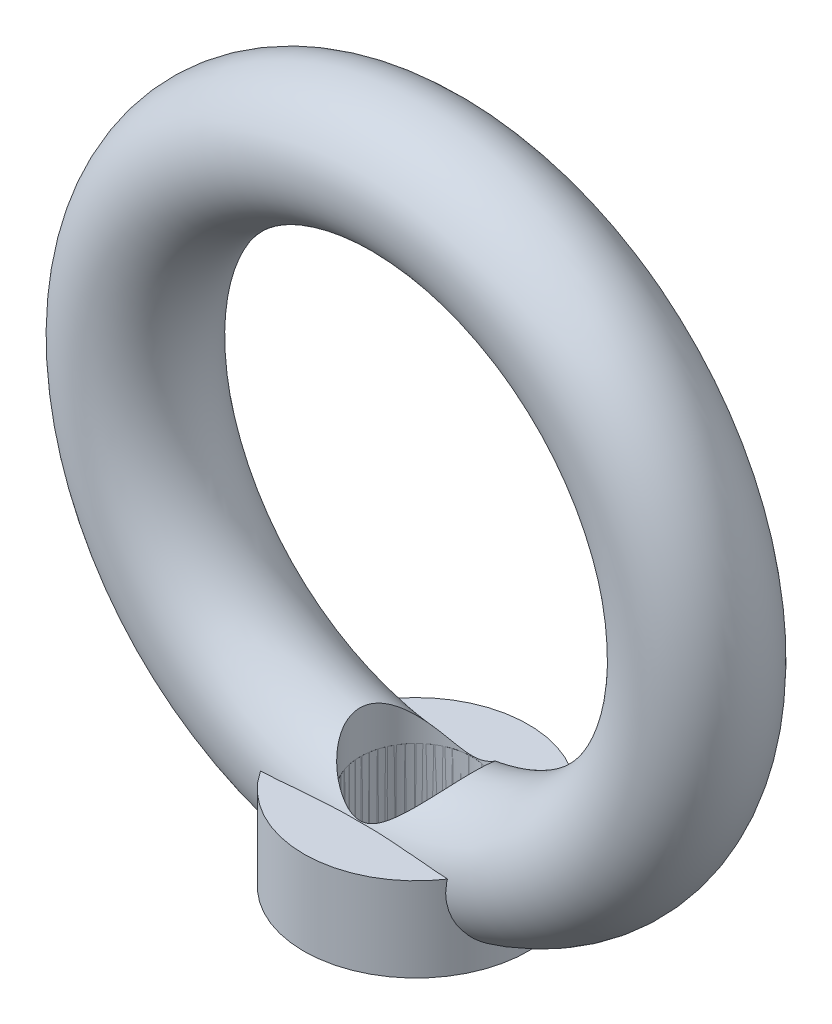
ISO-10303-21;
HEADER;
FILE_DESCRIPTION(('STEP AP214'),'2;1');
FILE_NAME('part.step','',(''),(''),'','','');
FILE_SCHEMA(('AUTOMOTIVE_DESIGN { 1 0 10303 214 1 1 1 1 }'));
ENDSEC;
DATA;
#1=APPLICATION_CONTEXT('core data for automotive mechanical design processes');
#2=APPLICATION_PROTOCOL_DEFINITION('international standard','automotive_design',2000,#1);
#3=PRODUCT_CONTEXT('',#1,'mechanical');
#4=PRODUCT('Part','Part','',(#3));
#5=PRODUCT_RELATED_PRODUCT_CATEGORY('part','',(#4));
#6=PRODUCT_DEFINITION_FORMATION('','',#4);
#7=PRODUCT_DEFINITION_CONTEXT('part definition',#1,'design');
#8=PRODUCT_DEFINITION('design','',#6,#7);
#9=PRODUCT_DEFINITION_SHAPE('','',#8);
#10=(LENGTH_UNIT() NAMED_UNIT(*) SI_UNIT(.MILLI.,.METRE.));
#11=(NAMED_UNIT(*) PLANE_ANGLE_UNIT() SI_UNIT($,.RADIAN.));
#12=(NAMED_UNIT(*) SI_UNIT($,.STERADIAN.) SOLID_ANGLE_UNIT());
#13=UNCERTAINTY_MEASURE_WITH_UNIT(LENGTH_MEASURE(1.E-05),#10,'distance_accuracy_value','');
#14=(GEOMETRIC_REPRESENTATION_CONTEXT(3) GLOBAL_UNCERTAINTY_ASSIGNED_CONTEXT((#13)) GLOBAL_UNIT_ASSIGNED_CONTEXT((#10,
#11,#12)) REPRESENTATION_CONTEXT('',''));
#15=CARTESIAN_POINT('',(0.,0.,0.));
#16=DIRECTION('',(0.,0.,1.));
#17=DIRECTION('',(1.,0.,0.));
#18=AXIS2_PLACEMENT_3D('',#15,#16,#17);
#19=CARTESIAN_POINT('',(0.,-9.,0.));
#20=DIRECTION('',(0.,1.,0.));
#21=DIRECTION('',(0.,0.,1.));
#22=AXIS2_PLACEMENT_3D('',#19,#20,#21);
#23=PLANE('',#22);
#24=CARTESIAN_POINT('',(0.,-9.,0.));
#25=DIRECTION('',(0.,1.,0.));
#26=DIRECTION('',(0.,0.,1.));
#27=AXIS2_PLACEMENT_3D('',#24,#25,#26);
#28=CIRCLE('',#27,4.);
#29=CARTESIAN_POINT('',(0.,-9.,4.));
#30=VERTEX_POINT('',#29);
#31=EDGE_CURVE('E11',#30,#30,#28,.T.);
#32=ORIENTED_EDGE('',*,*,#31,.T.);
#33=EDGE_LOOP('',(#32));
#34=FACE_BOUND('',#33,.T.);
#35=CARTESIAN_POINT('',(0.,-9.,0.));
#36=DIRECTION('',(0.,1.,0.));
#37=DIRECTION('',(0.,0.,1.));
#38=AXIS2_PLACEMENT_3D('',#35,#36,#37);
#39=CIRCLE('',#38,2.);
#40=CARTESIAN_POINT('',(0.,-9.,2.));
#41=VERTEX_POINT('',#40);
#42=EDGE_CURVE('E58',#41,#41,#39,.T.);
#43=ORIENTED_EDGE('',*,*,#42,.F.);
#44=EDGE_LOOP('',(#43));
#45=FACE_BOUND('',#44,.T.);
#46=ADVANCED_FACE('F47',(#34,#45),#23,.T.);
#47=CARTESIAN_POINT('',(0.,-12.,0.));
#48=DIRECTION('',(0.,1.,0.));
#49=DIRECTION('',(0.,0.,1.));
#50=AXIS2_PLACEMENT_3D('',#47,#48,#49);
#51=PLANE('',#50);
#52=CARTESIAN_POINT('',(0.,-12.,0.));
#53=DIRECTION('',(0.,1.,0.));
#54=DIRECTION('',(0.,0.,1.));
#55=AXIS2_PLACEMENT_3D('',#52,#53,#54);
#56=CIRCLE('',#55,4.);
#57=CARTESIAN_POINT('',(0.,-12.,4.));
#58=VERTEX_POINT('',#57);
#59=EDGE_CURVE('E51',#58,#58,#56,.T.);
#60=ORIENTED_EDGE('',*,*,#59,.F.);
#61=EDGE_LOOP('',(#60));
#62=FACE_BOUND('',#61,.T.);
#63=CARTESIAN_POINT('',(0.,-12.,0.));
#64=DIRECTION('',(0.,1.,0.));
#65=DIRECTION('',(0.,0.,1.));
#66=AXIS2_PLACEMENT_3D('',#63,#64,#65);
#67=CIRCLE('',#66,2.);
#68=CARTESIAN_POINT('',(0.,-12.,2.));
#69=VERTEX_POINT('',#68);
#70=EDGE_CURVE('E60',#69,#69,#67,.T.);
#71=ORIENTED_EDGE('',*,*,#70,.T.);
#72=EDGE_LOOP('',(#71));
#73=FACE_BOUND('',#72,.T.);
#74=ADVANCED_FACE('F70',(#62,#73),#51,.F.);
#75=CARTESIAN_POINT('',(0.,-9.,0.));
#76=DIRECTION('',(0.,-1.,0.));
#77=DIRECTION('',(0.,0.,-1.));
#78=AXIS2_PLACEMENT_3D('',#75,#76,#77);
#79=CYLINDRICAL_SURFACE('',#78,4.);
#80=ORIENTED_EDGE('',*,*,#31,.F.);
#81=EDGE_LOOP('',(#80));
#82=FACE_BOUND('',#81,.T.);
#83=ORIENTED_EDGE('',*,*,#59,.T.);
#84=EDGE_LOOP('',(#83));
#85=FACE_BOUND('',#84,.T.);
#86=ADVANCED_FACE('F49',(#82,#85),#79,.T.);
#87=CARTESIAN_POINT('',(0.,-9.,0.));
#88=DIRECTION('',(0.,-1.,0.));
#89=DIRECTION('',(0.,0.,-1.));
#90=AXIS2_PLACEMENT_3D('',#87,#88,#89);
#91=CYLINDRICAL_SURFACE('',#90,2.);
#92=ORIENTED_EDGE('',*,*,#42,.T.);
#93=EDGE_LOOP('',(#92));
#94=FACE_BOUND('',#93,.T.);
#95=ORIENTED_EDGE('',*,*,#70,.F.);
#96=EDGE_LOOP('',(#95));
#97=FACE_BOUND('',#96,.T.);
#98=ADVANCED_FACE('F66',(#94,#97),#91,.F.);
#99=CLOSED_SHELL('',(#46,#74,#86,#98));
#100=MANIFOLD_SOLID_BREP('B2',#99);
#101=CARTESIAN_POINT('',(0.,0.,0.));
#102=DIRECTION('',(0.,0.,-1.));
#103=DIRECTION('',(-1.,0.,0.));
#104=AXIS2_PLACEMENT_3D('',#101,#102,#103);
#105=TOROIDAL_SURFACE('',#104,10.,2.25);
#106=CARTESIAN_POINT('',(0.00947913291485531,-8.96917499990265,-1.99997753638364));
#107=CARTESIAN_POINT('',(-0.0465247045788909,-8.96973497754567,-2.00023859033637));
#108=CARTESIAN_POINT('',(-0.102633717571932,-8.9651251356805,-1.9981236990315));
#109=CARTESIAN_POINT('',(-0.212944447069803,-8.94652814074496,-1.98940818931956));
#110=CARTESIAN_POINT('',(-0.267140406044001,-8.93251486332256,-1.98279507337462));
#111=CARTESIAN_POINT('',(-0.394250947502609,-8.89028512718679,-1.96220851490686));
#112=CARTESIAN_POINT('',(-0.465656074420597,-8.85859337961999,-1.94632353473735));
#113=CARTESIAN_POINT('',(-0.602611359044454,-8.78720529324907,-1.90838850456801));
#114=CARTESIAN_POINT('',(-0.668138441115085,-8.74747924271782,-1.88631544982045));
#115=CARTESIAN_POINT('',(-0.790974048458028,-8.66582806455574,-1.83806418493892));
#116=CARTESIAN_POINT('',(-0.84853025820624,-8.62411436826384,-1.81214862462502));
#117=CARTESIAN_POINT('',(-0.95979127780467,-8.53861650651121,-1.75576017822046));
#118=CARTESIAN_POINT('',(-1.01349278078974,-8.49483061554779,-1.7252834467374));
#119=CARTESIAN_POINT('',(-1.11742946843156,-8.40643167159835,-1.65985619100568));
#120=CARTESIAN_POINT('',(-1.1676627849387,-8.36181818899002,-1.62490328414546));
#121=CARTESIAN_POINT('',(-1.26480043976249,-8.27271923802969,-1.55049002379123));
#122=CARTESIAN_POINT('',(-1.31170399321756,-8.22823380221492,-1.51102861327548));
#123=CARTESIAN_POINT('',(-1.43721428396703,-8.10612212128952,-1.39512833748848));
#124=CARTESIAN_POINT('',(-1.51227944202285,-8.02947849800628,-1.31369813968429));
#125=CARTESIAN_POINT('',(-1.65039276410907,-7.88404064174601,-1.13528221548769));
#126=CARTESIAN_POINT('',(-1.71347383103495,-7.81522513129827,-1.03834046738713));
#127=CARTESIAN_POINT('',(-1.80582565559466,-7.71231301606128,-0.863270568235746));
#128=CARTESIAN_POINT('',(-1.83934607226149,-7.67430505908354,-0.789705604078638));
#129=CARTESIAN_POINT('',(-1.89810488942724,-7.60696696405426,-0.635587479200465));
#130=CARTESIAN_POINT('',(-1.92335459514726,-7.57762498593498,-0.555044049497358));
#131=CARTESIAN_POINT('',(-1.96075769525226,-7.53388228594555,-0.400906789631065));
#132=CARTESIAN_POINT('',(-1.97431717055109,-7.51788973129134,-0.328113656309125));
#133=CARTESIAN_POINT('',(-1.99327557171502,-7.49548004681991,-0.180027908666608));
#134=CARTESIAN_POINT('',(-1.99868048876417,-7.48905588711204,-0.104737170951046));
#135=CARTESIAN_POINT('',(-2.0008925474968,-7.48643010724305,0.0462944965995305));
#136=CARTESIAN_POINT('',(-1.99768360892494,-7.49024760609524,0.122036004686834));
#137=CARTESIAN_POINT('',(-1.98290671754629,-7.50774455797193,0.271538209424397));
#138=CARTESIAN_POINT('',(-1.97133403210257,-7.5214295945452,0.345297760061987));
#139=CARTESIAN_POINT('',(-1.94091908352595,-7.55711745359702,0.487934789613104));
#140=CARTESIAN_POINT('',(-1.92218693820093,-7.5789941830923,0.55686836447712));
#141=CARTESIAN_POINT('',(-1.87849139833235,-7.62950407214588,0.69006554959925));
#142=CARTESIAN_POINT('',(-1.85352639636568,-7.65813897449944,0.754327949655842));
#143=CARTESIAN_POINT('',(-1.78074904748334,-7.7405576372625,0.917169552607534));
#144=CARTESIAN_POINT('',(-1.72851137081128,-7.79874408222048,1.01154133775907));
#145=CARTESIAN_POINT('',(-1.61301334704299,-7.923794708594,1.1871430406399));
#146=CARTESIAN_POINT('',(-1.54970971399601,-7.9906926940339,1.26831884023191));
#147=CARTESIAN_POINT('',(-1.43522946397048,-8.10729444100669,1.39460312932851));
#148=CARTESIAN_POINT('',(-1.38646144556287,-8.15582376716532,1.44304660112749));
#149=CARTESIAN_POINT('',(-1.28477660128321,-8.25393852620772,1.534282286448));
#150=CARTESIAN_POINT('',(-1.231857079652,-8.30352462982987,1.57707077871291));
#151=CARTESIAN_POINT('',(-1.12200773780673,-8.40245493929884,1.65701648675027));
#152=CARTESIAN_POINT('',(-1.06508746587847,-8.45179943933945,1.69418648514512));
#153=CARTESIAN_POINT('',(-0.946845573109951,-8.54896153028921,1.76299812700916));
#154=CARTESIAN_POINT('',(-0.885528233430776,-8.5967805426374,1.79464504756664));
#155=CARTESIAN_POINT('',(-0.768382010083402,-8.68126370847646,1.84743088080432));
#156=CARTESIAN_POINT('',(-0.713335104754199,-8.71846078635971,1.86944205887742));
#157=CARTESIAN_POINT('',(-0.599038933498382,-8.78858441871566,1.90913894247631));
#158=CARTESIAN_POINT('',(-0.539791082009121,-8.82151240010888,1.92682609504201));
#159=CARTESIAN_POINT('',(-0.425687945040576,-8.8757558205012,1.95491843361753));
#160=CARTESIAN_POINT('',(-0.371493083890968,-8.89807043377914,1.96601589267927));
#161=CARTESIAN_POINT('',(-0.259801036828623,-8.93471344769276,1.98385345522235));
#162=CARTESIAN_POINT('',(-0.202313980794896,-8.94906503207832,1.99060621721563));
#163=CARTESIAN_POINT('',(-0.0955955753728138,-8.96551995370505,1.99829809057988));
#164=CARTESIAN_POINT('',(-0.0466958772799337,-8.96933678731547,2.00005235771704));
#165=CARTESIAN_POINT('',(0.0510715598284761,-8.96910522247194,1.99994524896229));
#166=CARTESIAN_POINT('',(0.0999393029323301,-8.96505819663468,1.99808450406156));
#167=CARTESIAN_POINT('',(0.206783348261906,-8.94810036427411,1.99015241566743));
#168=CARTESIAN_POINT('',(0.264411174715209,-8.93344277507018,1.98324833116273));
#169=CARTESIAN_POINT('',(0.376372789830752,-8.89620312137371,1.96509259512848));
#170=CARTESIAN_POINT('',(0.430694808995071,-8.87359448786557,1.95382635421962));
#171=CARTESIAN_POINT('',(0.529662301297103,-8.82611309683543,1.92918211777213));
#172=CARTESIAN_POINT('',(0.574695408229153,-8.80181698164424,1.91620683511745));
#173=CARTESIAN_POINT('',(0.662319934928244,-8.7504408784613,1.88771128191146));
#174=CARTESIAN_POINT('',(0.704909289083638,-8.72335858788459,1.87218889994923));
#175=CARTESIAN_POINT('',(0.829642384246176,-8.63925782568437,1.82202272838793));
#176=CARTESIAN_POINT('',(0.908528441021871,-8.57950384093659,1.783838221169));
#177=CARTESIAN_POINT('',(1.04391505453244,-8.46972700016,1.70733330623213));
#178=CARTESIAN_POINT('',(1.10172397122508,-8.4201685017534,1.67058961400363));
#179=CARTESIAN_POINT('',(1.21318542495921,-8.32073071646747,1.59149476528975));
#180=CARTESIAN_POINT('',(1.26683529746224,-8.27085124575319,1.54914006034667));
#181=CARTESIAN_POINT('',(1.36989491557846,-8.17209177967528,1.45879175518347));
#182=CARTESIAN_POINT('',(1.41931256707451,-8.12321005668553,1.41080908402356));
#183=CARTESIAN_POINT('',(1.5137747309215,-8.02750727672924,1.30893335004023));
#184=CARTESIAN_POINT('',(1.55882245584647,-7.98068472001346,1.25504469206756));
#185=CARTESIAN_POINT('',(1.65384087666381,-7.87999785961372,1.12803306702979));
#186=CARTESIAN_POINT('',(1.7025983459718,-7.82695647644894,1.05332394726021));
#187=CARTESIAN_POINT('',(1.79129934028979,-7.72873395215454,0.894156232463209));
#188=CARTESIAN_POINT('',(1.83125804989802,-7.68353929838517,0.809714823026247));
#189=CARTESIAN_POINT('',(1.89303542452584,-7.61280158983799,0.649747022158888));
#190=CARTESIAN_POINT('',(1.91689530380694,-7.58512815349597,0.575968309195471));
#191=CARTESIAN_POINT('',(1.95625390784741,-7.53918523924031,0.423389092414931));
#192=CARTESIAN_POINT('',(1.97176048968997,-7.52090692505116,0.344593385864329));
#193=CARTESIAN_POINT('',(1.99325705059917,-7.49550647946059,0.183266542412526));
#194=CARTESIAN_POINT('',(1.99917416484712,-7.48846977221551,0.100711660495798));
#195=CARTESIAN_POINT('',(2.00066299306253,-7.48670267804532,-0.0646185499526013));
#196=CARTESIAN_POINT('',(1.99623705904687,-7.49196949328993,-0.147393824091253));
#197=CARTESIAN_POINT('',(1.97858301235252,-7.5128530244733,-0.300812094211115));
#198=CARTESIAN_POINT('',(1.96641987567907,-7.52721668538021,-0.371759655452356));
#199=CARTESIAN_POINT('',(1.93518740601831,-7.56381371692808,-0.509977621257046));
#200=CARTESIAN_POINT('',(1.91611499867525,-7.58605059074156,-0.57724637353404));
#201=CARTESIAN_POINT('',(1.86202387391097,-7.64847003490578,-0.736770050698773));
#202=CARTESIAN_POINT('',(1.82369678018324,-7.69221637934302,-0.826500372806554));
#203=CARTESIAN_POINT('',(1.73715733513364,-7.78897287542402,-0.995673656879974));
#204=CARTESIAN_POINT('',(1.68891901692024,-7.84200730636543,-1.0750886826193));
#205=CARTESIAN_POINT('',(1.59869714415327,-7.93867075886756,-1.20355043232682));
#206=CARTESIAN_POINT('',(1.55857953782028,-7.98093592830986,-1.25498293285842));
#207=CARTESIAN_POINT('',(1.47454061417007,-8.06755393022587,-1.35273295352575));
#208=CARTESIAN_POINT('',(1.43061877359828,-8.11190704950307,-1.39904976802313));
#209=CARTESIAN_POINT('',(1.33916613542405,-8.20185069323612,-1.48682818659266));
#210=CARTESIAN_POINT('',(1.29163046912578,-8.24744283188536,-1.52828304229497));
#211=CARTESIAN_POINT('',(1.19308140645008,-8.33888894423774,-1.60639507514014));
#212=CARTESIAN_POINT('',(1.14206941707396,-8.38474280520733,-1.64305417597397));
#213=CARTESIAN_POINT('',(1.01295483860557,-8.49602386122561,-1.7269115867385));
#214=CARTESIAN_POINT('',(0.932864895965993,-8.56112009458628,-1.77158114652454));
#215=CARTESIAN_POINT('',(0.806154471556868,-8.65446622570964,-1.8309211466141));
#216=CARTESIAN_POINT('',(0.762858164284908,-8.68484315442146,-1.8494122845202));
#217=CARTESIAN_POINT('',(0.673746288188683,-8.74331332678028,-1.88370540033746));
#218=CARTESIAN_POINT('',(0.627932464871249,-8.77140812006053,-1.89950921112704));
#219=CARTESIAN_POINT('',(0.528298965504772,-8.82699910169208,-1.92974116727346));
#220=CARTESIAN_POINT('',(0.474150153605593,-8.85409902449786,-1.94383359173813));
#221=CARTESIAN_POINT('',(0.362093900366199,-8.90151628488236,-1.96777681832627));
#222=CARTESIAN_POINT('',(0.304197707518788,-8.92185289002567,-1.97763969337612));
#223=CARTESIAN_POINT('',(0.206455771526146,-8.94710962663558,-1.98968843516269));
#224=CARTESIAN_POINT('',(0.167553794851842,-8.95494190087063,-1.99335822304056));
#225=CARTESIAN_POINT('',(0.0889448968321623,-8.96577422986823,-1.99840935794262));
#226=CARTESIAN_POINT('',(0.0492385199079548,-8.96877744914877,-1.99979220363509));
#227=CARTESIAN_POINT('',(0.00947913291485531,-8.96917499990265,-1.99997753638364));
#228=B_SPLINE_CURVE_WITH_KNOTS('',3,(#106,#107,#108,#109,#110,#111,#112,#113,#114,#115,#116,
#117,#118,#119,#120,#121,#122,#123,#124,#125,#126,#127,#128,#129,#130,#131,#132,#133,#134,#135,
#136,#137,#138,#139,#140,#141,#142,#143,#144,#145,#146,#147,#148,#149,#150,#151,#152,#153,#154,
#155,#156,#157,#158,#159,#160,#161,#162,#163,#164,#165,#166,#167,#168,#169,#170,#171,#172,#173,
#174,#175,#176,#177,#178,#179,#180,#181,#182,#183,#184,#185,#186,#187,#188,#189,#190,#191,#192,
#193,#194,#195,#196,#197,#198,#199,#200,#201,#202,#203,#204,#205,#206,#207,#208,#209,#210,#211,
#212,#213,#214,#215,#216,#217,#218,#219,#220,#221,#222,#223,#224,#225,#226,#227),.UNSPECIFIED.,
.T.,.F.,(4,2,2,2,2,2,2,2,2,2,2,2,2,2,2,2,2,2,2,2,2,2,2,2,2,2,2,2,2,2,2,2,2,2,2,2,2,2,2,2,2,2,2,
2,2,2,2,2,2,2,2,2,2,2,2,2,2,2,2,2,4),(0.,0.16783712894226,0.336142479274024,0.573932709112715,
0.812618944210012,1.0392874273788,1.2661480960984,1.49313002573833,1.72016528107265,
2.12282058788453,2.52435388210282,2.7914914843739,3.05826239794173,3.2845426011235,
3.51065647430855,3.73719274791077,3.96385730781839,4.18716743540473,4.41053521317359,
4.776148476917,5.14322526497457,5.39537284249173,5.64768552809288,5.89941524613493,
6.15090311343278,6.360586518314,6.57019965606096,6.74858746831332,6.92645315574132,
7.07295612626797,7.2194335273702,7.39798357416392,7.57713601906693,7.73527431209251,
7.89354436185438,8.21085357400131,8.4642463503455,8.71780014656506,8.97086946899981,
9.2237513134311,9.53419139178327,9.84409144972886,10.0901423173116,10.3359613443818,
10.5836395963316,10.8312615315431,11.0505534239839,11.2699430128492,11.588954673311,
11.9088130362903,12.1416958519218,12.3746107505144,12.6078452006393,12.8409858061452,
13.1774428404543,13.345408873832,13.5132598832446,13.6993372121617,13.8848798037879,
14.0041123287557,14.123266687815),.UNSPECIFIED.);
#229=CARTESIAN_POINT('',(0.00947913291485531,-8.96917499990265,-1.99997753638364));
#230=VERTEX_POINT('',#229);
#231=EDGE_CURVE('E120',#230,#230,#228,.T.);
#232=ORIENTED_EDGE('',*,*,#231,.F.);
#233=EDGE_LOOP('',(#232));
#234=FACE_BOUND('',#233,.T.);
#235=CARTESIAN_POINT('',(-1.35762130589315,-11.6255903124261,-1.46862670198773));
#236=CARTESIAN_POINT('',(-1.31324756533999,-11.5951901280932,-1.50964707688722));
#237=CARTESIAN_POINT('',(-1.26726864571846,-11.5641105931367,-1.54842404952915));
#238=CARTESIAN_POINT('',(-1.1723304999426,-11.5012324574823,-1.62149014641052));
#239=CARTESIAN_POINT('',(-1.12337091690305,-11.4694337709654,-1.65577873168528));
#240=CARTESIAN_POINT('',(-1.02247926283035,-11.4058194556859,-1.71991779237881));
#241=CARTESIAN_POINT('',(-0.970542107999674,-11.3740038957361,-1.74976034420155));
#242=CARTESIAN_POINT('',(-0.863741557627706,-11.3114150757814,-1.80487092223385));
#243=CARTESIAN_POINT('',(-0.808880009084109,-11.2806411775013,-1.83014179254159));
#244=CARTESIAN_POINT('',(-0.688353425185837,-11.2174700237956,-1.87908474078116));
#245=CARTESIAN_POINT('',(-0.62222915856496,-11.1854134470148,-1.90208170842315));
#246=CARTESIAN_POINT('',(-0.485525855190664,-11.1274303838431,-1.94146859323453));
#247=CARTESIAN_POINT('',(-0.414958942455735,-11.1014880583815,-1.95787566114775));
#248=CARTESIAN_POINT('',(-0.285524797120264,-11.0647058044197,-1.98034671524773));
#249=CARTESIAN_POINT('',(-0.227530573820753,-11.0517930568197,-1.98789709016928));
#250=CARTESIAN_POINT('',(-0.109888883738736,-11.0346131051629,-1.99784602556416));
#251=CARTESIAN_POINT('',(-0.0502455050524188,-11.0303261792929,-2.00025633887349));
#252=CARTESIAN_POINT('',(0.0690564747666991,-11.0313044284293,-1.99969943169404));
#253=CARTESIAN_POINT('',(0.128714851277267,-11.0365894180484,-1.99672105621178));
#254=CARTESIAN_POINT('',(0.246236335138954,-11.0556020180863,-1.98566663091491));
#255=CARTESIAN_POINT('',(0.304094573806312,-11.06935073276,-1.97757783696818));
#256=CARTESIAN_POINT('',(0.448831023518611,-11.1124280886762,-1.95105517820348));
#257=CARTESIAN_POINT('',(0.53374778276585,-11.1461701871948,-1.92936230253296));
#258=CARTESIAN_POINT('',(0.697215537193385,-11.2210806683202,-1.87651862250361));
#259=CARTESIAN_POINT('',(0.775738969684908,-11.2622789675305,-1.84532935850995));
#260=CARTESIAN_POINT('',(0.908801742451828,-11.337261518019,-1.78271958357469));
#261=CARTESIAN_POINT('',(0.964567782417709,-11.3704462342298,-1.75315830608526));
#262=CARTESIAN_POINT('',(1.07289961085636,-11.4372235467947,-1.6890396298383));
#263=CARTESIAN_POINT('',(1.12546395490952,-11.4708163191624,-1.65447999949387));
#264=CARTESIAN_POINT('',(1.27813486711221,-11.5706083672193,-1.54343281433163));
#265=CARTESIAN_POINT('',(1.37352515238005,-11.6360049625661,-1.45943283179854));
#266=CARTESIAN_POINT('',(1.5311063920515,-11.7461245300435,-1.2908041544553));
#267=CARTESIAN_POINT('',(1.59610598566961,-11.7923494398566,-1.20976393148416));
#268=CARTESIAN_POINT('',(1.71416988462416,-11.8770266714583,-1.0356923002503));
#269=CARTESIAN_POINT('',(1.76724017438279,-11.9154828894826,-0.942666941431237));
#270=CARTESIAN_POINT('',(1.8591679988147,-11.9823672003196,-0.745279888977114));
#271=CARTESIAN_POINT('',(1.89789291826441,-12.0107016411164,-0.640823447570946));
#272=CARTESIAN_POINT('',(1.95765919216911,-12.0545037030348,-0.424407992941673));
#273=CARTESIAN_POINT('',(1.97872061003803,-12.069985922385,-0.312457648375679));
#274=CARTESIAN_POINT('',(1.99971031728481,-12.0854178279914,-0.102722369221332));
#275=CARTESIAN_POINT('',(2.00234549855693,-12.0873569849134,-0.00534574326542001));
#276=CARTESIAN_POINT('',(1.99346426558238,-12.0808252034323,0.188387640766387));
#277=CARTESIAN_POINT('',(1.98195231273454,-12.0723575468914,0.284744710703171));
#278=CARTESIAN_POINT('',(1.94665301520049,-12.0464389571891,0.467646628172795));
#279=CARTESIAN_POINT('',(1.92365886997395,-12.0295686576319,0.554431253114089));
#280=CARTESIAN_POINT('',(1.86704666255578,-11.9881547069557,0.722499272705088));
#281=CARTESIAN_POINT('',(1.83342648241193,-11.9636095261108,0.803781566720327));
#282=CARTESIAN_POINT('',(1.75389101687198,-11.9058207979151,0.965738855641196));
#283=CARTESIAN_POINT('',(1.70720387541955,-11.8720361135519,1.04583829853087));
#284=CARTESIAN_POINT('',(1.60482424367234,-11.7985968622533,1.19703257326794));
#285=CARTESIAN_POINT('',(1.54912842378286,-11.7589401254756,1.26812405839494));
#286=CARTESIAN_POINT('',(1.41977368932011,-11.6681500999407,1.41252252108564));
#287=CARTESIAN_POINT('',(1.34467711036478,-11.6162232040088,1.48403719091235));
#288=CARTESIAN_POINT('',(1.18555618211332,-11.5095221954197,1.61401373765852));
#289=CARTESIAN_POINT('',(1.1015183755418,-11.4547438562424,1.67245551670631));
#290=CARTESIAN_POINT('',(0.931205160221009,-11.3500012449733,1.77255284792351));
#291=CARTESIAN_POINT('',(0.845488440297905,-11.2999664369153,1.81509103974242));
#292=CARTESIAN_POINT('',(0.666092271362495,-11.2056688064533,1.88830251167499));
#293=CARTESIAN_POINT('',(0.572430730046284,-11.1613935446104,1.91900165345477));
#294=CARTESIAN_POINT('',(0.416665674614541,-11.1029216936955,1.95700918901912));
#295=CARTESIAN_POINT('',(0.357522999854355,-11.0838572341755,1.96874083901812));
#296=CARTESIAN_POINT('',(0.236555577116849,-11.0536167214422,1.98689700514897));
#297=CARTESIAN_POINT('',(0.174740658543275,-11.0424140009651,1.99333947510399));
#298=CARTESIAN_POINT('',(0.0490777819946342,-11.0301182758225,2.00039378910816));
#299=CARTESIAN_POINT('',(-0.014784308050536,-11.0291272706363,2.00094680834334));
#300=CARTESIAN_POINT('',(-0.141585123161035,-11.0377933312606,1.99599560483191));
#301=CARTESIAN_POINT('',(-0.204522086306186,-11.0474685729653,1.99048104261097));
#302=CARTESIAN_POINT('',(-0.344768711872093,-11.0791290056642,1.97166306113257));
#303=CARTESIAN_POINT('',(-0.42120475351271,-11.1037903706175,1.95661933483329));
#304=CARTESIAN_POINT('',(-0.569055961795823,-11.1612530666836,1.9188656695565));
#305=CARTESIAN_POINT('',(-0.640449012963385,-11.1940877011946,1.89612422499985));
#306=CARTESIAN_POINT('',(-0.767596341710354,-11.2583052645878,1.84787736472846));
#307=CARTESIAN_POINT('',(-0.824041320676215,-11.2891005032854,1.82337344676899));
#308=CARTESIAN_POINT('',(-0.933876854991516,-11.3520517909319,1.769636947025));
#309=CARTESIAN_POINT('',(-0.987265644616869,-11.3842086082422,1.74040166827234));
#310=CARTESIAN_POINT('',(-1.09106839904522,-11.4487641457265,1.67727701799637));
#311=CARTESIAN_POINT('',(-1.1414820296088,-11.4811628926208,1.64338712497559));
#312=CARTESIAN_POINT('',(-1.23928874410379,-11.5453841037839,1.5709449244778));
#313=CARTESIAN_POINT('',(-1.28668030787932,-11.5772062723509,1.53239029836695));
#314=CARTESIAN_POINT('',(-1.3792157876268,-11.6402570650888,1.44972301503623));
#315=CARTESIAN_POINT('',(-1.42428646968931,-11.6714568387096,1.40550598875743));
#316=CARTESIAN_POINT('',(-1.51063407217496,-11.7318405603422,1.31225805796463));
#317=CARTESIAN_POINT('',(-1.55191175357587,-11.7610249124085,1.26322812314978));
#318=CARTESIAN_POINT('',(-1.63010237198582,-11.8166899293986,1.16056768884604));
#319=CARTESIAN_POINT('',(-1.66702488949634,-11.8431765106643,1.10694775284651));
#320=CARTESIAN_POINT('',(-1.7360019308511,-11.8928868448865,0.995291162687414));
#321=CARTESIAN_POINT('',(-1.76805895985366,-11.9161122764899,0.937256804705509));
#322=CARTESIAN_POINT('',(-1.83792499827557,-11.966881928194,0.794079430557492));
#323=CARTESIAN_POINT('',(-1.87324208799957,-11.9926786917697,0.707059899843502));
#324=CARTESIAN_POINT('',(-1.93164447505905,-12.035420760334,0.526973426500911));
#325=CARTESIAN_POINT('',(-1.95473750014405,-12.0523716573632,0.433910346335546));
#326=CARTESIAN_POINT('',(-1.98743834955804,-12.0763909532173,0.243769262410793));
#327=CARTESIAN_POINT('',(-1.99699169085579,-12.0834194242414,0.146676646655514));
#328=CARTESIAN_POINT('',(-2.00179217526217,-12.0869500612267,-0.0480480842069541));
#329=CARTESIAN_POINT('',(-1.99704162395855,-12.0834539236079,-0.145680109836748));
#330=CARTESIAN_POINT('',(-1.97433747163406,-12.0667662822767,-0.33200833625876));
#331=CARTESIAN_POINT('',(-1.95726186466526,-12.0542195463919,-0.420872945132144));
#332=CARTESIAN_POINT('',(-1.91183634908218,-12.0209153709098,-0.594055138699115));
#333=CARTESIAN_POINT('',(-1.88348284085986,-12.0001553098476,-0.678371261869342));
#334=CARTESIAN_POINT('',(-1.81518323067178,-11.9503339991071,-0.84474681843652));
#335=CARTESIAN_POINT('',(-1.77473411114868,-11.9209136624754,-0.926489567886015));
#336=CARTESIAN_POINT('',(-1.68455212168599,-11.8557484974665,-1.08182782750689));
#337=CARTESIAN_POINT('',(-1.63482304139914,-11.820006251074,-1.15542664393751));
#338=CARTESIAN_POINT('',(-1.54693267526989,-11.7575158096919,-1.26891262510673));
#339=CARTESIAN_POINT('',(-1.51105844766069,-11.7321664930183,-1.3113923449017));
#340=CARTESIAN_POINT('',(-1.43643280874445,-11.679926192893,-1.39273326228523));
#341=CARTESIAN_POINT('',(-1.39768118212485,-11.6530350941059,-1.43159418859204));
#342=CARTESIAN_POINT('',(-1.35762130589315,-11.6255903124261,-1.46862670198773));
#343=B_SPLINE_CURVE_WITH_KNOTS('',3,(#235,#236,#237,#238,#239,#240,#241,#242,#243,#244,#245,
#246,#247,#248,#249,#250,#251,#252,#253,#254,#255,#256,#257,#258,#259,#260,#261,#262,#263,#264,
#265,#266,#267,#268,#269,#270,#271,#272,#273,#274,#275,#276,#277,#278,#279,#280,#281,#282,#283,
#284,#285,#286,#287,#288,#289,#290,#291,#292,#293,#294,#295,#296,#297,#298,#299,#300,#301,#302,
#303,#304,#305,#306,#307,#308,#309,#310,#311,#312,#313,#314,#315,#316,#317,#318,#319,#320,#321,
#322,#323,#324,#325,#326,#327,#328,#329,#330,#331,#332,#333,#334,#335,#336,#337,#338,#339,#340,
#341,#342),.UNSPECIFIED.,.T.,.F.,(4,2,2,2,2,2,2,2,2,2,2,2,2,2,2,2,2,2,2,2,2,2,2,2,2,2,2,2,2,2,2,
2,2,2,2,2,2,2,2,2,2,2,2,2,2,2,2,2,2,2,2,2,2,4),(0.,0.202878897490229,0.40578213433492,
0.60904276173491,0.812176500111132,1.04270220576468,1.27262400045675,1.45159089640959,
1.63014814087743,1.8090754353503,1.98845070146151,2.26861742500984,2.54993424457465,
2.76360131797419,2.97736408230502,3.40374877657386,3.74358611938527,4.08325259794576,
4.42598507025486,4.76832771427304,5.05906902810101,5.34971867812272,5.62260546074034,
5.89554666874204,6.19045834543033,6.48547927117087,6.83216583738525,7.17938178103133,
7.50253485285779,7.82497796350599,8.01412160515004,8.20262052340168,8.3930004550894,
8.58370530721925,8.82747426391953,9.07225324194622,9.27842919752435,9.48472309407049,
9.69104012242317,9.89746012649231,10.1084616902877,10.319420828654,10.5299068841045,
10.740284193459,11.0311522089,11.3218361245508,11.6136864490035,11.9054897337775,
12.1783316167896,12.4512606536891,12.737657988377,13.0239386220653,13.2070806041611,
13.3902363044057),.UNSPECIFIED.);
#344=CARTESIAN_POINT('',(-1.35762130589315,-11.6255903124261,-1.46862670198773));
#345=VERTEX_POINT('',#344);
#346=EDGE_CURVE('E46',#345,#345,#343,.T.);
#347=ORIENTED_EDGE('',*,*,#346,.F.);
#348=EDGE_LOOP('',(#347));
#349=FACE_BOUND('',#348,.T.);
#350=ADVANCED_FACE('F109',(#234,#349),#105,.T.);
#351=CARTESIAN_POINT('',(0.,1.,0.));
#352=DIRECTION('',(0.,-1.,0.));
#353=DIRECTION('',(0.,0.,-1.));
#354=AXIS2_PLACEMENT_3D('',#351,#352,#353);
#355=CYLINDRICAL_SURFACE('',#354,2.);
#356=ORIENTED_EDGE('',*,*,#231,.T.);
#357=EDGE_LOOP('',(#356));
#358=FACE_BOUND('',#357,.T.);
#359=ORIENTED_EDGE('',*,*,#346,.T.);
#360=EDGE_LOOP('',(#359));
#361=FACE_BOUND('',#360,.T.);
#362=ADVANCED_FACE('F130',(#358,#361),#355,.F.);
#363=CLOSED_SHELL('',(#350,#362));
#364=MANIFOLD_SOLID_BREP('B6',#363);
#365=ADVANCED_BREP_SHAPE_REPRESENTATION('',(#18,#100,#364),#14);
#366=SHAPE_DEFINITION_REPRESENTATION(#9,#365);
ENDSEC;
END-ISO-10303-21;
